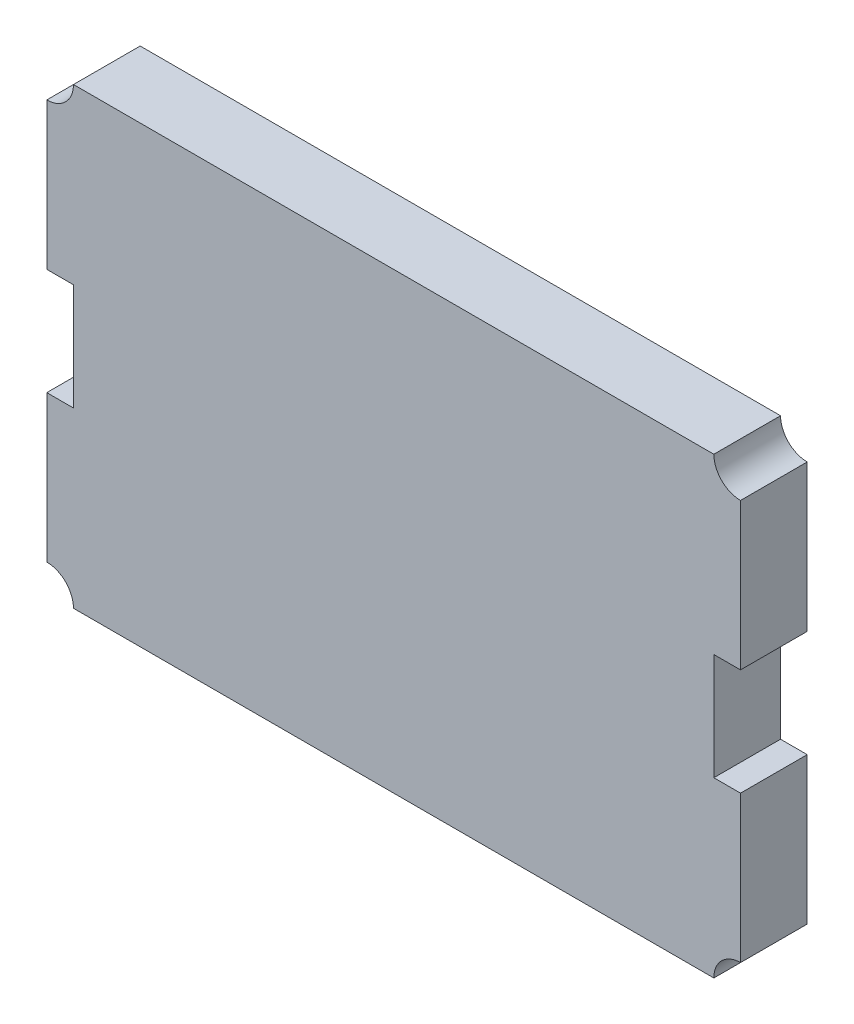
ISO-10303-21;
HEADER;
FILE_DESCRIPTION(('STEP AP214'),'2;1');
FILE_NAME('part.step','',(''),(''),'','','');
FILE_SCHEMA(('AUTOMOTIVE_DESIGN { 1 0 10303 214 1 1 1 1 }'));
ENDSEC;
DATA;
#1=APPLICATION_CONTEXT('core data for automotive mechanical design processes');
#2=APPLICATION_PROTOCOL_DEFINITION('international standard','automotive_design',2000,#1);
#3=PRODUCT_CONTEXT('',#1,'mechanical');
#4=PRODUCT('Part','Part','',(#3));
#5=PRODUCT_RELATED_PRODUCT_CATEGORY('part','',(#4));
#6=PRODUCT_DEFINITION_FORMATION('','',#4);
#7=PRODUCT_DEFINITION_CONTEXT('part definition',#1,'design');
#8=PRODUCT_DEFINITION('design','',#6,#7);
#9=PRODUCT_DEFINITION_SHAPE('','',#8);
#10=(LENGTH_UNIT() NAMED_UNIT(*) SI_UNIT(.MILLI.,.METRE.));
#11=(NAMED_UNIT(*) PLANE_ANGLE_UNIT() SI_UNIT($,.RADIAN.));
#12=(NAMED_UNIT(*) SI_UNIT($,.STERADIAN.) SOLID_ANGLE_UNIT());
#13=UNCERTAINTY_MEASURE_WITH_UNIT(LENGTH_MEASURE(1.E-05),#10,'distance_accuracy_value','');
#14=(GEOMETRIC_REPRESENTATION_CONTEXT(3) GLOBAL_UNCERTAINTY_ASSIGNED_CONTEXT((#13)) GLOBAL_UNIT_ASSIGNED_CONTEXT((#10,
#11,#12)) REPRESENTATION_CONTEXT('',''));
#15=CARTESIAN_POINT('',(0.,0.,0.));
#16=DIRECTION('',(0.,0.,1.));
#17=DIRECTION('',(1.,0.,0.));
#18=AXIS2_PLACEMENT_3D('',#15,#16,#17);
#19=CARTESIAN_POINT('',(-2.6,-1.5,0.52));
#20=DIRECTION('',(0.,0.,1.));
#21=DIRECTION('',(1.,0.,0.));
#22=AXIS2_PLACEMENT_3D('',#19,#20,#21);
#23=PLANE('',#22);
#24=DIRECTION('',(0.,1.,0.));
#25=VECTOR('',#24,1.);
#26=CARTESIAN_POINT('',(-2.6,-1.5,0.52));
#27=LINE('',#26,#25);
#28=CARTESIAN_POINT('',(-2.6,1.5,0.52));
#29=VERTEX_POINT('',#28);
#30=CARTESIAN_POINT('',(-2.6,0.4,0.52));
#31=VERTEX_POINT('',#30);
#32=EDGE_CURVE('E136',#29,#31,#27,.F.);
#33=ORIENTED_EDGE('',*,*,#32,.T.);
#34=DIRECTION('',(1.,0.,0.));
#35=VECTOR('',#34,1.);
#36=CARTESIAN_POINT('',(-2.6,0.4,0.52));
#37=LINE('',#36,#35);
#38=CARTESIAN_POINT('',(-2.4,0.4,0.52));
#39=VERTEX_POINT('',#38);
#40=EDGE_CURVE('E232',#31,#39,#37,.T.);
#41=ORIENTED_EDGE('',*,*,#40,.T.);
#42=DIRECTION('',(0.,1.,0.));
#43=VECTOR('',#42,1.);
#44=CARTESIAN_POINT('',(-2.4,-1.5,0.52));
#45=LINE('',#44,#43);
#46=CARTESIAN_POINT('',(-2.4,-0.4,0.52));
#47=VERTEX_POINT('',#46);
#48=EDGE_CURVE('E137',#39,#47,#45,.F.);
#49=ORIENTED_EDGE('',*,*,#48,.T.);
#50=DIRECTION('',(1.,0.,0.));
#51=VECTOR('',#50,1.);
#52=CARTESIAN_POINT('',(-2.4,-0.4,0.52));
#53=LINE('',#52,#51);
#54=CARTESIAN_POINT('',(-2.6,-0.4,0.52));
#55=VERTEX_POINT('',#54);
#56=EDGE_CURVE('E215',#47,#55,#53,.F.);
#57=ORIENTED_EDGE('',*,*,#56,.T.);
#58=DIRECTION('',(0.,1.,0.));
#59=VECTOR('',#58,1.);
#60=CARTESIAN_POINT('',(-2.6,-1.5,0.52));
#61=LINE('',#60,#59);
#62=CARTESIAN_POINT('',(-2.6,-1.5,0.52));
#63=VERTEX_POINT('',#62);
#64=EDGE_CURVE('E212',#63,#55,#61,.T.);
#65=ORIENTED_EDGE('',*,*,#64,.F.);
#66=CARTESIAN_POINT('',(-2.6,-1.7,0.52));
#67=DIRECTION('',(0.,0.,-1.));
#68=DIRECTION('',(-1.,0.,0.));
#69=AXIS2_PLACEMENT_3D('',#66,#67,#68);
#70=CIRCLE('',#69,0.2);
#71=CARTESIAN_POINT('',(-2.4,-1.7,0.52));
#72=VERTEX_POINT('',#71);
#73=EDGE_CURVE('E208',#63,#72,#70,.T.);
#74=ORIENTED_EDGE('',*,*,#73,.T.);
#75=DIRECTION('',(1.,0.,0.));
#76=VECTOR('',#75,1.);
#77=CARTESIAN_POINT('',(2.4,-1.7,0.52));
#78=LINE('',#77,#76);
#79=CARTESIAN_POINT('',(2.4,-1.7,0.52));
#80=VERTEX_POINT('',#79);
#81=EDGE_CURVE('E205',#80,#72,#78,.F.);
#82=ORIENTED_EDGE('',*,*,#81,.F.);
#83=CARTESIAN_POINT('',(2.6,-1.7,0.52));
#84=DIRECTION('',(0.,0.,-1.));
#85=DIRECTION('',(-1.,0.,0.));
#86=AXIS2_PLACEMENT_3D('',#83,#84,#85);
#87=CIRCLE('',#86,0.2);
#88=CARTESIAN_POINT('',(2.6,-1.5,0.52));
#89=VERTEX_POINT('',#88);
#90=EDGE_CURVE('E201',#80,#89,#87,.T.);
#91=ORIENTED_EDGE('',*,*,#90,.T.);
#92=DIRECTION('',(0.,1.,0.));
#93=VECTOR('',#92,1.);
#94=CARTESIAN_POINT('',(2.6,-0.4,0.52));
#95=LINE('',#94,#93);
#96=CARTESIAN_POINT('',(2.6,-0.4,0.52));
#97=VERTEX_POINT('',#96);
#98=EDGE_CURVE('E196',#97,#89,#95,.F.);
#99=ORIENTED_EDGE('',*,*,#98,.F.);
#100=DIRECTION('',(1.,0.,0.));
#101=VECTOR('',#100,1.);
#102=CARTESIAN_POINT('',(2.4,-0.4,0.52));
#103=LINE('',#102,#101);
#104=CARTESIAN_POINT('',(2.4,-0.4,0.52));
#105=VERTEX_POINT('',#104);
#106=EDGE_CURVE('E186',#105,#97,#103,.T.);
#107=ORIENTED_EDGE('',*,*,#106,.F.);
#108=DIRECTION('',(0.,1.,0.));
#109=VECTOR('',#108,1.);
#110=CARTESIAN_POINT('',(2.4,0.4,0.52));
#111=LINE('',#110,#109);
#112=CARTESIAN_POINT('',(2.4,0.4,0.52));
#113=VERTEX_POINT('',#112);
#114=EDGE_CURVE('E176',#113,#105,#111,.F.);
#115=ORIENTED_EDGE('',*,*,#114,.F.);
#116=DIRECTION('',(1.,0.,0.));
#117=VECTOR('',#116,1.);
#118=CARTESIAN_POINT('',(2.6,0.4,0.52));
#119=LINE('',#118,#117);
#120=CARTESIAN_POINT('',(2.6,0.4,0.52));
#121=VERTEX_POINT('',#120);
#122=EDGE_CURVE('E164',#121,#113,#119,.F.);
#123=ORIENTED_EDGE('',*,*,#122,.F.);
#124=DIRECTION('',(0.,1.,0.));
#125=VECTOR('',#124,1.);
#126=CARTESIAN_POINT('',(2.6,1.5,0.52));
#127=LINE('',#126,#125);
#128=CARTESIAN_POINT('',(2.6,1.5,0.52));
#129=VERTEX_POINT('',#128);
#130=EDGE_CURVE('E161',#129,#121,#127,.F.);
#131=ORIENTED_EDGE('',*,*,#130,.F.);
#132=CARTESIAN_POINT('',(2.6,1.7,0.52));
#133=DIRECTION('',(0.,0.,-1.));
#134=DIRECTION('',(-1.,0.,0.));
#135=AXIS2_PLACEMENT_3D('',#132,#133,#134);
#136=CIRCLE('',#135,0.2);
#137=CARTESIAN_POINT('',(2.4,1.7,0.52));
#138=VERTEX_POINT('',#137);
#139=EDGE_CURVE('E141',#129,#138,#136,.T.);
#140=ORIENTED_EDGE('',*,*,#139,.T.);
#141=DIRECTION('',(1.,0.,0.));
#142=VECTOR('',#141,1.);
#143=CARTESIAN_POINT('',(-2.4,1.7,0.52));
#144=LINE('',#143,#142);
#145=CARTESIAN_POINT('',(-2.4,1.7,0.52));
#146=VERTEX_POINT('',#145);
#147=EDGE_CURVE('E139',#146,#138,#144,.T.);
#148=ORIENTED_EDGE('',*,*,#147,.F.);
#149=CARTESIAN_POINT('',(-2.6,1.7,0.52));
#150=DIRECTION('',(0.,0.,-1.));
#151=DIRECTION('',(-1.,0.,0.));
#152=AXIS2_PLACEMENT_3D('',#149,#150,#151);
#153=CIRCLE('',#152,0.2);
#154=EDGE_CURVE('E20',#146,#29,#153,.T.);
#155=ORIENTED_EDGE('',*,*,#154,.T.);
#156=EDGE_LOOP('',(#33,#41,#49,#57,#65,#74,#82,#91,#99,#107,#115,#123,#131,#140,#148,#155));
#157=FACE_BOUND('',#156,.T.);
#158=ADVANCED_FACE('F17',(#157),#23,.T.);
#159=CARTESIAN_POINT('',(-2.4,-0.4,0.02));
#160=DIRECTION('',(0.,-1.,0.));
#161=DIRECTION('',(0.,0.,-1.));
#162=AXIS2_PLACEMENT_3D('',#159,#160,#161);
#163=PLANE('',#162);
#164=ORIENTED_EDGE('',*,*,#56,.F.);
#165=DIRECTION('',(0.,0.,-1.));
#166=VECTOR('',#165,1.);
#167=CARTESIAN_POINT('',(-2.4,-0.4,0.02));
#168=LINE('',#167,#166);
#169=CARTESIAN_POINT('',(-2.4,-0.4,0.02));
#170=VERTEX_POINT('',#169);
#171=EDGE_CURVE('E222',#47,#170,#168,.T.);
#172=ORIENTED_EDGE('',*,*,#171,.T.);
#173=DIRECTION('',(1.,0.,0.));
#174=VECTOR('',#173,1.);
#175=CARTESIAN_POINT('',(-2.6,-0.4,0.02));
#176=LINE('',#175,#174);
#177=CARTESIAN_POINT('',(-2.6,-0.4,0.02));
#178=VERTEX_POINT('',#177);
#179=EDGE_CURVE('E218',#170,#178,#176,.F.);
#180=ORIENTED_EDGE('',*,*,#179,.T.);
#181=DIRECTION('',(0.,0.,1.));
#182=VECTOR('',#181,1.);
#183=CARTESIAN_POINT('',(-2.6,-0.4,0.02));
#184=LINE('',#183,#182);
#185=EDGE_CURVE('E213',#55,#178,#184,.F.);
#186=ORIENTED_EDGE('',*,*,#185,.F.);
#187=EDGE_LOOP('',(#164,#172,#180,#186));
#188=FACE_BOUND('',#187,.T.);
#189=ADVANCED_FACE('F326',(#188),#163,.F.);
#190=CARTESIAN_POINT('',(-2.6,-1.5,0.02));
#191=DIRECTION('',(-1.,0.,0.));
#192=DIRECTION('',(0.,0.,1.));
#193=AXIS2_PLACEMENT_3D('',#190,#191,#192);
#194=PLANE('',#193);
#195=DIRECTION('',(0.,0.,-1.));
#196=VECTOR('',#195,1.);
#197=CARTESIAN_POINT('',(-2.6,-1.5,0.02));
#198=LINE('',#197,#196);
#199=CARTESIAN_POINT('',(-2.6,-1.5,0.02));
#200=VERTEX_POINT('',#199);
#201=EDGE_CURVE('E209',#200,#63,#198,.F.);
#202=ORIENTED_EDGE('',*,*,#201,.T.);
#203=ORIENTED_EDGE('',*,*,#64,.T.);
#204=ORIENTED_EDGE('',*,*,#185,.T.);
#205=DIRECTION('',(0.,1.,0.));
#206=VECTOR('',#205,1.);
#207=CARTESIAN_POINT('',(-2.6,-1.5,0.02));
#208=LINE('',#207,#206);
#209=EDGE_CURVE('E221',#178,#200,#208,.F.);
#210=ORIENTED_EDGE('',*,*,#209,.T.);
#211=EDGE_LOOP('',(#202,#203,#204,#210));
#212=FACE_BOUND('',#211,.T.);
#213=ADVANCED_FACE('F304',(#212),#194,.T.);
#214=CARTESIAN_POINT('',(-2.6,-1.7,0.02));
#215=DIRECTION('',(0.,0.,-1.));
#216=DIRECTION('',(-1.,0.,0.));
#217=AXIS2_PLACEMENT_3D('',#214,#215,#216);
#218=CYLINDRICAL_SURFACE('',#217,0.2);
#219=ORIENTED_EDGE('',*,*,#201,.F.);
#220=CARTESIAN_POINT('',(-2.6,-1.7,0.02));
#221=DIRECTION('',(0.,0.,-1.));
#222=DIRECTION('',(-1.,0.,0.));
#223=AXIS2_PLACEMENT_3D('',#220,#221,#222);
#224=CIRCLE('',#223,0.2);
#225=CARTESIAN_POINT('',(-2.4,-1.7,0.02));
#226=VERTEX_POINT('',#225);
#227=EDGE_CURVE('E283',#200,#226,#224,.T.);
#228=ORIENTED_EDGE('',*,*,#227,.T.);
#229=DIRECTION('',(0.,0.,-1.));
#230=VECTOR('',#229,1.);
#231=CARTESIAN_POINT('',(-2.4,-1.7,0.02));
#232=LINE('',#231,#230);
#233=EDGE_CURVE('E206',#72,#226,#232,.T.);
#234=ORIENTED_EDGE('',*,*,#233,.F.);
#235=ORIENTED_EDGE('',*,*,#73,.F.);
#236=EDGE_LOOP('',(#219,#228,#234,#235));
#237=FACE_BOUND('',#236,.T.);
#238=ADVANCED_FACE('F295',(#237),#218,.F.);
#239=CARTESIAN_POINT('',(2.4,-1.7,0.02));
#240=DIRECTION('',(0.,-1.,0.));
#241=DIRECTION('',(0.,0.,-1.));
#242=AXIS2_PLACEMENT_3D('',#239,#240,#241);
#243=PLANE('',#242);
#244=DIRECTION('',(0.,0.,-1.));
#245=VECTOR('',#244,1.);
#246=CARTESIAN_POINT('',(2.4,-1.7,0.02));
#247=LINE('',#246,#245);
#248=CARTESIAN_POINT('',(2.4,-1.7,0.02));
#249=VERTEX_POINT('',#248);
#250=EDGE_CURVE('E202',#249,#80,#247,.F.);
#251=ORIENTED_EDGE('',*,*,#250,.T.);
#252=ORIENTED_EDGE('',*,*,#81,.T.);
#253=ORIENTED_EDGE('',*,*,#233,.T.);
#254=DIRECTION('',(1.,0.,0.));
#255=VECTOR('',#254,1.);
#256=CARTESIAN_POINT('',(-2.6,-1.7,0.02));
#257=LINE('',#256,#255);
#258=EDGE_CURVE('E282',#226,#249,#257,.T.);
#259=ORIENTED_EDGE('',*,*,#258,.T.);
#260=EDGE_LOOP('',(#251,#252,#253,#259));
#261=FACE_BOUND('',#260,.T.);
#262=ADVANCED_FACE('F292',(#261),#243,.T.);
#263=CARTESIAN_POINT('',(2.6,-1.7,0.02));
#264=DIRECTION('',(0.,0.,-1.));
#265=DIRECTION('',(-1.,0.,0.));
#266=AXIS2_PLACEMENT_3D('',#263,#264,#265);
#267=CYLINDRICAL_SURFACE('',#266,0.2);
#268=ORIENTED_EDGE('',*,*,#250,.F.);
#269=CARTESIAN_POINT('',(2.6,-1.7,0.02));
#270=DIRECTION('',(0.,0.,-1.));
#271=DIRECTION('',(-1.,0.,0.));
#272=AXIS2_PLACEMENT_3D('',#269,#270,#271);
#273=CIRCLE('',#272,0.2);
#274=CARTESIAN_POINT('',(2.6,-1.5,0.02));
#275=VERTEX_POINT('',#274);
#276=EDGE_CURVE('E279',#249,#275,#273,.T.);
#277=ORIENTED_EDGE('',*,*,#276,.T.);
#278=DIRECTION('',(0.,0.,-1.));
#279=VECTOR('',#278,1.);
#280=CARTESIAN_POINT('',(2.6,-1.5,0.02));
#281=LINE('',#280,#279);
#282=EDGE_CURVE('E199',#89,#275,#281,.T.);
#283=ORIENTED_EDGE('',*,*,#282,.F.);
#284=ORIENTED_EDGE('',*,*,#90,.F.);
#285=EDGE_LOOP('',(#268,#277,#283,#284));
#286=FACE_BOUND('',#285,.T.);
#287=ADVANCED_FACE('F347',(#286),#267,.F.);
#288=CARTESIAN_POINT('',(2.6,-0.4,0.02));
#289=DIRECTION('',(1.,0.,0.));
#290=DIRECTION('',(0.,0.,-1.));
#291=AXIS2_PLACEMENT_3D('',#288,#289,#290);
#292=PLANE('',#291);
#293=DIRECTION('',(0.,0.,1.));
#294=VECTOR('',#293,1.);
#295=CARTESIAN_POINT('',(2.6,-0.4,0.02));
#296=LINE('',#295,#294);
#297=CARTESIAN_POINT('',(2.6,-0.4,0.02));
#298=VERTEX_POINT('',#297);
#299=EDGE_CURVE('E194',#97,#298,#296,.F.);
#300=ORIENTED_EDGE('',*,*,#299,.F.);
#301=ORIENTED_EDGE('',*,*,#98,.T.);
#302=ORIENTED_EDGE('',*,*,#282,.T.);
#303=DIRECTION('',(0.,1.,0.));
#304=VECTOR('',#303,1.);
#305=CARTESIAN_POINT('',(2.6,-1.5,0.02));
#306=LINE('',#305,#304);
#307=EDGE_CURVE('E191',#275,#298,#306,.T.);
#308=ORIENTED_EDGE('',*,*,#307,.T.);
#309=EDGE_LOOP('',(#300,#301,#302,#308));
#310=FACE_BOUND('',#309,.T.);
#311=ADVANCED_FACE('F342',(#310),#292,.T.);
#312=CARTESIAN_POINT('',(2.4,-0.4,0.02));
#313=DIRECTION('',(0.,1.,0.));
#314=DIRECTION('',(0.,0.,1.));
#315=AXIS2_PLACEMENT_3D('',#312,#313,#314);
#316=PLANE('',#315);
#317=DIRECTION('',(0.,0.,-1.));
#318=VECTOR('',#317,1.);
#319=CARTESIAN_POINT('',(2.4,-0.4,0.02));
#320=LINE('',#319,#318);
#321=CARTESIAN_POINT('',(2.4,-0.4,0.02));
#322=VERTEX_POINT('',#321);
#323=EDGE_CURVE('E184',#105,#322,#320,.T.);
#324=ORIENTED_EDGE('',*,*,#323,.F.);
#325=ORIENTED_EDGE('',*,*,#106,.T.);
#326=ORIENTED_EDGE('',*,*,#299,.T.);
#327=DIRECTION('',(1.,0.,0.));
#328=VECTOR('',#327,1.);
#329=CARTESIAN_POINT('',(-2.6,-0.4,0.02));
#330=LINE('',#329,#328);
#331=EDGE_CURVE('E181',#298,#322,#330,.F.);
#332=ORIENTED_EDGE('',*,*,#331,.T.);
#333=EDGE_LOOP('',(#324,#325,#326,#332));
#334=FACE_BOUND('',#333,.T.);
#335=ADVANCED_FACE('F350',(#334),#316,.T.);
#336=CARTESIAN_POINT('',(2.4,0.4,0.02));
#337=DIRECTION('',(1.,0.,0.));
#338=DIRECTION('',(0.,0.,-1.));
#339=AXIS2_PLACEMENT_3D('',#336,#337,#338);
#340=PLANE('',#339);
#341=DIRECTION('',(0.,0.,-1.));
#342=VECTOR('',#341,1.);
#343=CARTESIAN_POINT('',(2.4,0.4,0.02));
#344=LINE('',#343,#342);
#345=CARTESIAN_POINT('',(2.4,0.4,0.02));
#346=VERTEX_POINT('',#345);
#347=EDGE_CURVE('E174',#113,#346,#344,.T.);
#348=ORIENTED_EDGE('',*,*,#347,.F.);
#349=ORIENTED_EDGE('',*,*,#114,.T.);
#350=ORIENTED_EDGE('',*,*,#323,.T.);
#351=DIRECTION('',(0.,1.,0.));
#352=VECTOR('',#351,1.);
#353=CARTESIAN_POINT('',(2.4,-1.5,0.02));
#354=LINE('',#353,#352);
#355=EDGE_CURVE('E171',#322,#346,#354,.T.);
#356=ORIENTED_EDGE('',*,*,#355,.T.);
#357=EDGE_LOOP('',(#348,#349,#350,#356));
#358=FACE_BOUND('',#357,.T.);
#359=ADVANCED_FACE('F353',(#358),#340,.T.);
#360=CARTESIAN_POINT('',(2.6,0.4,0.02));
#361=DIRECTION('',(0.,-1.,0.));
#362=DIRECTION('',(0.,0.,-1.));
#363=AXIS2_PLACEMENT_3D('',#360,#361,#362);
#364=PLANE('',#363);
#365=DIRECTION('',(0.,0.,-1.));
#366=VECTOR('',#365,1.);
#367=CARTESIAN_POINT('',(2.6,0.4,0.02));
#368=LINE('',#367,#366);
#369=CARTESIAN_POINT('',(2.6,0.4,0.02));
#370=VERTEX_POINT('',#369);
#371=EDGE_CURVE('E162',#121,#370,#368,.T.);
#372=ORIENTED_EDGE('',*,*,#371,.F.);
#373=ORIENTED_EDGE('',*,*,#122,.T.);
#374=ORIENTED_EDGE('',*,*,#347,.T.);
#375=DIRECTION('',(1.,0.,0.));
#376=VECTOR('',#375,1.);
#377=CARTESIAN_POINT('',(-2.6,0.4,0.02));
#378=LINE('',#377,#376);
#379=EDGE_CURVE('E167',#346,#370,#378,.T.);
#380=ORIENTED_EDGE('',*,*,#379,.T.);
#381=EDGE_LOOP('',(#372,#373,#374,#380));
#382=FACE_BOUND('',#381,.T.);
#383=ADVANCED_FACE('F359',(#382),#364,.T.);
#384=CARTESIAN_POINT('',(2.6,1.5,0.02));
#385=DIRECTION('',(1.,0.,0.));
#386=DIRECTION('',(0.,0.,-1.));
#387=AXIS2_PLACEMENT_3D('',#384,#385,#386);
#388=PLANE('',#387);
#389=DIRECTION('',(0.,0.,-1.));
#390=VECTOR('',#389,1.);
#391=CARTESIAN_POINT('',(2.6,1.5,0.02));
#392=LINE('',#391,#390);
#393=CARTESIAN_POINT('',(2.6,1.5,0.02));
#394=VERTEX_POINT('',#393);
#395=EDGE_CURVE('E158',#394,#129,#392,.F.);
#396=ORIENTED_EDGE('',*,*,#395,.T.);
#397=ORIENTED_EDGE('',*,*,#130,.T.);
#398=ORIENTED_EDGE('',*,*,#371,.T.);
#399=DIRECTION('',(0.,1.,0.));
#400=VECTOR('',#399,1.);
#401=CARTESIAN_POINT('',(2.6,-1.5,0.02));
#402=LINE('',#401,#400);
#403=EDGE_CURVE('E170',#370,#394,#402,.T.);
#404=ORIENTED_EDGE('',*,*,#403,.T.);
#405=EDGE_LOOP('',(#396,#397,#398,#404));
#406=FACE_BOUND('',#405,.T.);
#407=ADVANCED_FACE('F361',(#406),#388,.T.);
#408=CARTESIAN_POINT('',(2.6,1.7,0.02));
#409=DIRECTION('',(0.,0.,-1.));
#410=DIRECTION('',(-1.,0.,0.));
#411=AXIS2_PLACEMENT_3D('',#408,#409,#410);
#412=CYLINDRICAL_SURFACE('',#411,0.2);
#413=ORIENTED_EDGE('',*,*,#395,.F.);
#414=CARTESIAN_POINT('',(2.6,1.7,0.02));
#415=DIRECTION('',(0.,0.,-1.));
#416=DIRECTION('',(-1.,0.,0.));
#417=AXIS2_PLACEMENT_3D('',#414,#415,#416);
#418=CIRCLE('',#417,0.2);
#419=CARTESIAN_POINT('',(2.4,1.7,0.02));
#420=VERTEX_POINT('',#419);
#421=EDGE_CURVE('E276',#394,#420,#418,.T.);
#422=ORIENTED_EDGE('',*,*,#421,.T.);
#423=DIRECTION('',(0.,0.,1.));
#424=VECTOR('',#423,1.);
#425=CARTESIAN_POINT('',(2.4,1.7,0.02));
#426=LINE('',#425,#424);
#427=EDGE_CURVE('E144',#138,#420,#426,.F.);
#428=ORIENTED_EDGE('',*,*,#427,.F.);
#429=ORIENTED_EDGE('',*,*,#139,.F.);
#430=EDGE_LOOP('',(#413,#422,#428,#429));
#431=FACE_BOUND('',#430,.T.);
#432=ADVANCED_FACE('F363',(#431),#412,.F.);
#433=CARTESIAN_POINT('',(-2.4,1.7,0.02));
#434=DIRECTION('',(0.,1.,0.));
#435=DIRECTION('',(0.,0.,1.));
#436=AXIS2_PLACEMENT_3D('',#433,#434,#435);
#437=PLANE('',#436);
#438=DIRECTION('',(0.,0.,-1.));
#439=VECTOR('',#438,1.);
#440=CARTESIAN_POINT('',(-2.4,1.7,0.02));
#441=LINE('',#440,#439);
#442=CARTESIAN_POINT('',(-2.4,1.7,0.02));
#443=VERTEX_POINT('',#442);
#444=EDGE_CURVE('E131',#443,#146,#441,.F.);
#445=ORIENTED_EDGE('',*,*,#444,.T.);
#446=ORIENTED_EDGE('',*,*,#147,.T.);
#447=ORIENTED_EDGE('',*,*,#427,.T.);
#448=DIRECTION('',(1.,0.,0.));
#449=VECTOR('',#448,1.);
#450=CARTESIAN_POINT('',(-2.6,1.7,0.02));
#451=LINE('',#450,#449);
#452=EDGE_CURVE('E149',#420,#443,#451,.F.);
#453=ORIENTED_EDGE('',*,*,#452,.T.);
#454=EDGE_LOOP('',(#445,#446,#447,#453));
#455=FACE_BOUND('',#454,.T.);
#456=ADVANCED_FACE('F147',(#455),#437,.T.);
#457=CARTESIAN_POINT('',(-2.6,1.7,0.02));
#458=DIRECTION('',(0.,0.,-1.));
#459=DIRECTION('',(-1.,0.,0.));
#460=AXIS2_PLACEMENT_3D('',#457,#458,#459);
#461=CYLINDRICAL_SURFACE('',#460,0.2);
#462=ORIENTED_EDGE('',*,*,#444,.F.);
#463=CARTESIAN_POINT('',(-2.6,1.7,0.02));
#464=DIRECTION('',(0.,0.,-1.));
#465=DIRECTION('',(-1.,0.,0.));
#466=AXIS2_PLACEMENT_3D('',#463,#464,#465);
#467=CIRCLE('',#466,0.2);
#468=CARTESIAN_POINT('',(-2.6,1.5,0.02));
#469=VERTEX_POINT('',#468);
#470=EDGE_CURVE('E273',#443,#469,#467,.T.);
#471=ORIENTED_EDGE('',*,*,#470,.T.);
#472=DIRECTION('',(0.,0.,1.));
#473=VECTOR('',#472,1.);
#474=CARTESIAN_POINT('',(-2.6,1.5,0.02));
#475=LINE('',#474,#473);
#476=EDGE_CURVE('E133',#29,#469,#475,.F.);
#477=ORIENTED_EDGE('',*,*,#476,.F.);
#478=ORIENTED_EDGE('',*,*,#154,.F.);
#479=EDGE_LOOP('',(#462,#471,#477,#478));
#480=FACE_BOUND('',#479,.T.);
#481=ADVANCED_FACE('F128',(#480),#461,.F.);
#482=CARTESIAN_POINT('',(-2.6,0.4,0.02));
#483=DIRECTION('',(-1.,0.,0.));
#484=DIRECTION('',(0.,0.,1.));
#485=AXIS2_PLACEMENT_3D('',#482,#483,#484);
#486=PLANE('',#485);
#487=DIRECTION('',(0.,0.,1.));
#488=VECTOR('',#487,1.);
#489=CARTESIAN_POINT('',(-2.6,0.4,0.02));
#490=LINE('',#489,#488);
#491=CARTESIAN_POINT('',(-2.6,0.4,0.02));
#492=VERTEX_POINT('',#491);
#493=EDGE_CURVE('E151',#492,#31,#490,.T.);
#494=ORIENTED_EDGE('',*,*,#493,.T.);
#495=ORIENTED_EDGE('',*,*,#32,.F.);
#496=ORIENTED_EDGE('',*,*,#476,.T.);
#497=DIRECTION('',(0.,1.,0.));
#498=VECTOR('',#497,1.);
#499=CARTESIAN_POINT('',(-2.6,-1.5,0.02));
#500=LINE('',#499,#498);
#501=EDGE_CURVE('E275',#469,#492,#500,.F.);
#502=ORIENTED_EDGE('',*,*,#501,.T.);
#503=EDGE_LOOP('',(#494,#495,#496,#502));
#504=FACE_BOUND('',#503,.T.);
#505=ADVANCED_FACE('F319',(#504),#486,.T.);
#506=CARTESIAN_POINT('',(-2.6,0.4,0.02));
#507=DIRECTION('',(0.,1.,0.));
#508=DIRECTION('',(0.,0.,1.));
#509=AXIS2_PLACEMENT_3D('',#506,#507,#508);
#510=PLANE('',#509);
#511=ORIENTED_EDGE('',*,*,#40,.F.);
#512=ORIENTED_EDGE('',*,*,#493,.F.);
#513=DIRECTION('',(1.,0.,0.));
#514=VECTOR('',#513,1.);
#515=CARTESIAN_POINT('',(-2.6,0.4,0.02));
#516=LINE('',#515,#514);
#517=CARTESIAN_POINT('',(-2.4,0.4,0.02));
#518=VERTEX_POINT('',#517);
#519=EDGE_CURVE('E26',#492,#518,#516,.T.);
#520=ORIENTED_EDGE('',*,*,#519,.T.);
#521=DIRECTION('',(0.,0.,-1.));
#522=VECTOR('',#521,1.);
#523=CARTESIAN_POINT('',(-2.4,0.4,0.02));
#524=LINE('',#523,#522);
#525=EDGE_CURVE('E34',#518,#39,#524,.F.);
#526=ORIENTED_EDGE('',*,*,#525,.T.);
#527=EDGE_LOOP('',(#511,#512,#520,#526));
#528=FACE_BOUND('',#527,.T.);
#529=ADVANCED_FACE('F322',(#528),#510,.F.);
#530=CARTESIAN_POINT('',(-2.4,0.4,0.02));
#531=DIRECTION('',(1.,0.,0.));
#532=DIRECTION('',(0.,0.,-1.));
#533=AXIS2_PLACEMENT_3D('',#530,#531,#532);
#534=PLANE('',#533);
#535=ORIENTED_EDGE('',*,*,#48,.F.);
#536=ORIENTED_EDGE('',*,*,#525,.F.);
#537=DIRECTION('',(0.,1.,0.));
#538=VECTOR('',#537,1.);
#539=CARTESIAN_POINT('',(-2.4,-1.5,0.02));
#540=LINE('',#539,#538);
#541=EDGE_CURVE('E11',#518,#170,#540,.F.);
#542=ORIENTED_EDGE('',*,*,#541,.T.);
#543=ORIENTED_EDGE('',*,*,#171,.F.);
#544=EDGE_LOOP('',(#535,#536,#542,#543));
#545=FACE_BOUND('',#544,.T.);
#546=ADVANCED_FACE('F327',(#545),#534,.F.);
#547=CARTESIAN_POINT('',(-2.6,-1.5,0.02));
#548=DIRECTION('',(0.,0.,1.));
#549=DIRECTION('',(1.,0.,0.));
#550=AXIS2_PLACEMENT_3D('',#547,#548,#549);
#551=PLANE('',#550);
#552=ORIENTED_EDGE('',*,*,#519,.F.);
#553=ORIENTED_EDGE('',*,*,#501,.F.);
#554=ORIENTED_EDGE('',*,*,#470,.F.);
#555=ORIENTED_EDGE('',*,*,#452,.F.);
#556=ORIENTED_EDGE('',*,*,#421,.F.);
#557=ORIENTED_EDGE('',*,*,#403,.F.);
#558=ORIENTED_EDGE('',*,*,#379,.F.);
#559=ORIENTED_EDGE('',*,*,#355,.F.);
#560=ORIENTED_EDGE('',*,*,#331,.F.);
#561=ORIENTED_EDGE('',*,*,#307,.F.);
#562=ORIENTED_EDGE('',*,*,#276,.F.);
#563=ORIENTED_EDGE('',*,*,#258,.F.);
#564=ORIENTED_EDGE('',*,*,#227,.F.);
#565=ORIENTED_EDGE('',*,*,#209,.F.);
#566=ORIENTED_EDGE('',*,*,#179,.F.);
#567=ORIENTED_EDGE('',*,*,#541,.F.);
#568=EDGE_LOOP('',(#552,#553,#554,#555,#556,#557,#558,#559,#560,#561,#562,#563,#564,#565,#566,#567));
#569=FACE_BOUND('',#568,.T.);
#570=ADVANCED_FACE('F301',(#569),#551,.F.);
#571=CLOSED_SHELL('',(#158,#189,#213,#238,#262,#287,#311,#335,#359,#383,#407,#432,#456,#481,
#505,#529,#546,#570));
#572=MANIFOLD_SOLID_BREP('B1',#571);
#573=ADVANCED_BREP_SHAPE_REPRESENTATION('',(#18,#572),#14);
#574=SHAPE_DEFINITION_REPRESENTATION(#9,#573);
ENDSEC;
END-ISO-10303-21;
